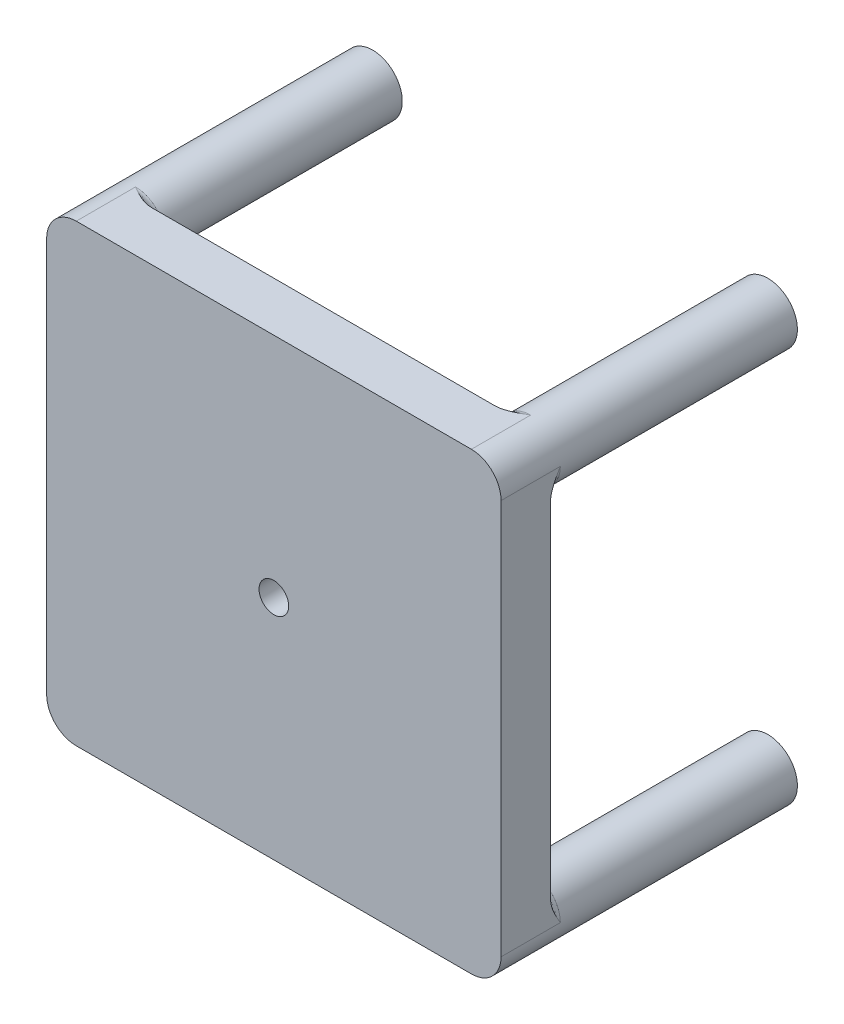
ISO-10303-21;
HEADER;
FILE_DESCRIPTION(('STEP AP214'),'2;1');
FILE_NAME('part.step','',(''),(''),'','','');
FILE_SCHEMA(('AUTOMOTIVE_DESIGN { 1 0 10303 214 1 1 1 1 }'));
ENDSEC;
DATA;
#1=APPLICATION_CONTEXT('core data for automotive mechanical design processes');
#2=APPLICATION_PROTOCOL_DEFINITION('international standard','automotive_design',2000,#1);
#3=PRODUCT_CONTEXT('',#1,'mechanical');
#4=PRODUCT('Part','Part','',(#3));
#5=PRODUCT_RELATED_PRODUCT_CATEGORY('part','',(#4));
#6=PRODUCT_DEFINITION_FORMATION('','',#4);
#7=PRODUCT_DEFINITION_CONTEXT('part definition',#1,'design');
#8=PRODUCT_DEFINITION('design','',#6,#7);
#9=PRODUCT_DEFINITION_SHAPE('','',#8);
#10=(LENGTH_UNIT() NAMED_UNIT(*) SI_UNIT(.MILLI.,.METRE.));
#11=(NAMED_UNIT(*) PLANE_ANGLE_UNIT() SI_UNIT($,.RADIAN.));
#12=(NAMED_UNIT(*) SI_UNIT($,.STERADIAN.) SOLID_ANGLE_UNIT());
#13=UNCERTAINTY_MEASURE_WITH_UNIT(LENGTH_MEASURE(1.E-05),#10,'distance_accuracy_value','');
#14=(GEOMETRIC_REPRESENTATION_CONTEXT(3) GLOBAL_UNCERTAINTY_ASSIGNED_CONTEXT((#13)) GLOBAL_UNIT_ASSIGNED_CONTEXT((#10,
#11,#12)) REPRESENTATION_CONTEXT('',''));
#15=CARTESIAN_POINT('',(0.,0.,0.));
#16=DIRECTION('',(0.,0.,1.));
#17=DIRECTION('',(1.,0.,0.));
#18=AXIS2_PLACEMENT_3D('',#15,#16,#17);
#19=CARTESIAN_POINT('',(2.7567149821564E-07,39.9999999776482,25.));
#20=DIRECTION('',(0.,0.,-1.));
#21=DIRECTION('',(-1.,0.,0.));
#22=AXIS2_PLACEMENT_3D('',#19,#20,#21);
#23=CYLINDRICAL_SURFACE('',#22,3.00000034272673);
#24=CARTESIAN_POINT('',(2.7567149821564E-07,39.9999999776482,19.));
#25=DIRECTION('',(0.,0.,-1.));
#26=DIRECTION('',(-1.,0.,0.));
#27=AXIS2_PLACEMENT_3D('',#24,#25,#26);
#28=CIRCLE('',#27,3.00000034272673);
#29=CARTESIAN_POINT('',(2.75671498583035E-07,43.000000320375,19.));
#30=VERTEX_POINT('',#29);
#31=CARTESIAN_POINT('',(-3.00000006705523,39.9999999776482,19.));
#32=VERTEX_POINT('',#31);
#33=EDGE_CURVE('E241',#30,#32,#28,.T.);
#34=ORIENTED_EDGE('',*,*,#33,.T.);
#35=DIRECTION('',(0.,0.,-1.));
#36=VECTOR('',#35,1.);
#37=CARTESIAN_POINT('',(-3.00000006705523,39.9999999776482,25.));
#38=LINE('',#37,#36);
#39=CARTESIAN_POINT('',(-3.00000006705523,39.9999999776482,25.));
#40=VERTEX_POINT('',#39);
#41=EDGE_CURVE('E156',#40,#32,#38,.T.);
#42=ORIENTED_EDGE('',*,*,#41,.F.);
#43=CARTESIAN_POINT('',(2.7567149821564E-07,39.9999999776482,25.));
#44=DIRECTION('',(0.,0.,-1.));
#45=DIRECTION('',(-1.,0.,0.));
#46=AXIS2_PLACEMENT_3D('',#43,#44,#45);
#47=CIRCLE('',#46,3.00000034272673);
#48=CARTESIAN_POINT('',(2.75671498583035E-07,43.000000320375,25.));
#49=VERTEX_POINT('',#48);
#50=EDGE_CURVE('E150',#40,#49,#47,.T.);
#51=ORIENTED_EDGE('',*,*,#50,.T.);
#52=DIRECTION('',(0.,0.,-1.));
#53=VECTOR('',#52,1.);
#54=CARTESIAN_POINT('',(2.75671498583035E-07,43.000000320375,25.));
#55=LINE('',#54,#53);
#56=EDGE_CURVE('E135',#49,#30,#55,.T.);
#57=ORIENTED_EDGE('',*,*,#56,.T.);
#58=EDGE_LOOP('',(#34,#42,#51,#57));
#59=FACE_BOUND('',#58,.T.);
#60=CARTESIAN_POINT('',(2.7567149821564E-07,39.9999999776482,-5.));
#61=DIRECTION('',(0.,0.,-1.));
#62=DIRECTION('',(-1.,0.,0.));
#63=AXIS2_PLACEMENT_3D('',#60,#61,#62);
#64=CIRCLE('',#63,3.);
#65=CARTESIAN_POINT('',(-2.9999997243285,39.9999999776482,-5.));
#66=VERTEX_POINT('',#65);
#67=EDGE_CURVE('E387',#66,#66,#64,.T.);
#68=ORIENTED_EDGE('',*,*,#67,.F.);
#69=EDGE_LOOP('',(#68));
#70=FACE_BOUND('',#69,.T.);
#71=ADVANCED_FACE('F39',(#59,#70),#23,.T.);
#72=CARTESIAN_POINT('',(-3.00000006705523,2.23517419850605E-08,25.));
#73=DIRECTION('',(-1.,0.,0.));
#74=DIRECTION('',(0.,0.,1.));
#75=AXIS2_PLACEMENT_3D('',#72,#73,#74);
#76=PLANE('',#75);
#77=DIRECTION('',(0.,1.,0.));
#78=VECTOR('',#77,1.);
#79=CARTESIAN_POINT('',(-3.00000006705523,2.23517419850605E-08,20.));
#80=LINE('',#79,#78);
#81=CARTESIAN_POINT('',(-3.00000006705523,2.64575135031266,20.));
#82=VERTEX_POINT('',#81);
#83=CARTESIAN_POINT('',(-3.00000006705523,37.3542485370451,20.));
#84=VERTEX_POINT('',#83);
#85=EDGE_CURVE('E160',#82,#84,#80,.T.);
#86=ORIENTED_EDGE('',*,*,#85,.F.);
#87=CARTESIAN_POINT('',(-3.00000006705523,2.64575135031266,20.));
#88=CARTESIAN_POINT('',(-3.00000006705523,2.57016198336439,19.9999805694454));
#89=CARTESIAN_POINT('',(-3.00000006705523,2.49467527798329,19.9962547406682));
#90=CARTESIAN_POINT('',(-3.00000006705523,2.34444812320498,19.9823512795283));
#91=CARTESIAN_POINT('',(-3.00000006705523,2.26970642330828,19.9721874590272));
#92=CARTESIAN_POINT('',(-3.00000006705523,2.04907999549026,19.933822682465));
#93=CARTESIAN_POINT('',(-3.00000006705523,1.90458090500975,19.8976904420534));
#94=CARTESIAN_POINT('',(-3.00000006705523,1.6077420643123,19.8060282246102));
#95=CARTESIAN_POINT('',(-3.00000006705523,1.45587700870992,19.7490381296509));
#96=CARTESIAN_POINT('',(-3.00000006705523,1.15738945346902,19.6225399327557));
#97=CARTESIAN_POINT('',(-3.00000006705523,1.01077319285479,19.5530174900065));
#98=CARTESIAN_POINT('',(-3.00000006705523,0.575079625561138,19.3319536204799));
#99=CARTESIAN_POINT('',(-3.00000006705523,0.292147653571668,19.1686707604753));
#100=CARTESIAN_POINT('',(-3.00000006705523,0.00632455537559661,19.0036514515353));
#101=CARTESIAN_POINT('',(-3.00000006705523,0.00316227741475037,19.0018257092023));
#102=CARTESIAN_POINT('',(-3.00000006705523,2.23517419850605E-08,19.));
#103=B_SPLINE_CURVE_WITH_KNOTS('',3,(#87,#88,#89,#90,#91,#92,#93,#94,#95,#96,#97,#98,#99,#100,
#101,#102),.UNSPECIFIED.,.F.,.F.,(4,2,2,2,2,2,2,4),(0.,0.226523099325113,0.452561861634844,
0.898071978622388,1.38391998838047,1.87032752642806,2.84948261711076,2.86043706834255),.UNSPECIFIED.);
#104=CARTESIAN_POINT('',(-3.00000006705523,2.23517419850605E-08,19.));
#105=VERTEX_POINT('',#104);
#106=EDGE_CURVE('E256',#82,#105,#103,.T.);
#107=ORIENTED_EDGE('',*,*,#106,.T.);
#108=DIRECTION('',(0.,0.,-1.));
#109=VECTOR('',#108,1.);
#110=CARTESIAN_POINT('',(-3.00000006705523,2.23517419850605E-08,25.));
#111=LINE('',#110,#109);
#112=CARTESIAN_POINT('',(-3.00000006705523,2.23517419850605E-08,25.));
#113=VERTEX_POINT('',#112);
#114=EDGE_CURVE('E208',#113,#105,#111,.T.);
#115=ORIENTED_EDGE('',*,*,#114,.F.);
#116=DIRECTION('',(0.,1.,0.));
#117=VECTOR('',#116,1.);
#118=CARTESIAN_POINT('',(-3.00000006705523,2.23517419850605E-08,25.));
#119=LINE('',#118,#117);
#120=EDGE_CURVE('E141',#113,#40,#119,.T.);
#121=ORIENTED_EDGE('',*,*,#120,.T.);
#122=ORIENTED_EDGE('',*,*,#41,.T.);
#123=CARTESIAN_POINT('',(-3.00000006705523,37.3542485370451,20.));
#124=CARTESIAN_POINT('',(-3.00000006705523,37.4298379087591,19.9999805694405));
#125=CARTESIAN_POINT('',(-3.00000006705523,37.5053246188965,19.9962547404358));
#126=CARTESIAN_POINT('',(-3.00000006705523,37.6555517831477,19.9823512784979));
#127=CARTESIAN_POINT('',(-3.00000006705523,37.730293487761,19.9721874574273));
#128=CARTESIAN_POINT('',(-3.00000006705523,37.950919929677,19.9338226787902));
#129=CARTESIAN_POINT('',(-3.00000006705523,38.0954190294846,19.8976904365043));
#130=CARTESIAN_POINT('',(-3.00000006705523,38.3922578834329,19.806028216521));
#131=CARTESIAN_POINT('',(-3.00000006705523,38.5441229431875,19.7490381215777));
#132=CARTESIAN_POINT('',(-3.00000006705523,38.8426105071439,19.622539925285));
#133=CARTESIAN_POINT('',(-3.00000006705523,38.9892267723233,19.5530174831257));
#134=CARTESIAN_POINT('',(-3.00000006705522,39.424920353695,19.3319536159639));
#135=CARTESIAN_POINT('',(-3.00000006705518,39.7078523357372,19.168670758248));
#136=CARTESIAN_POINT('',(-3.00000006705523,39.9936754442315,19.0036514515802));
#137=CARTESIAN_POINT('',(-3.00000006705523,39.9968377223888,19.0018257092248));
#138=CARTESIAN_POINT('',(-3.00000006705523,39.9999999776482,19.));
#139=B_SPLINE_CURVE_WITH_KNOTS('',3,(#123,#124,#125,#126,#127,#128,#129,#130,#131,#132,#133,
#134,#135,#136,#137,#138),.UNSPECIFIED.,.F.,.F.,(4,2,2,2,2,2,2,4),(0.,0.226523113603853,
0.452561890154132,0.898072035627803,1.3839200571458,1.8703276068537,2.84948272034063,
2.86043717211653),.UNSPECIFIED.);
#140=EDGE_CURVE('E281',#32,#84,#139,.F.);
#141=ORIENTED_EDGE('',*,*,#140,.T.);
#142=EDGE_LOOP('',(#86,#107,#115,#121,#122,#141));
#143=FACE_BOUND('',#142,.T.);
#144=ADVANCED_FACE('F342',(#143),#76,.T.);
#145=CARTESIAN_POINT('',(-2.23517467555501E-08,2.23517419850605E-08,25.));
#146=DIRECTION('',(0.,0.,-1.));
#147=DIRECTION('',(-1.,0.,0.));
#148=AXIS2_PLACEMENT_3D('',#145,#146,#147);
#149=CYLINDRICAL_SURFACE('',#148,3.00000004470348);
#150=CARTESIAN_POINT('',(-2.23517467555501E-08,2.23517419850605E-08,19.));
#151=DIRECTION('',(0.,0.,-1.));
#152=DIRECTION('',(-1.,0.,0.));
#153=AXIS2_PLACEMENT_3D('',#150,#151,#152);
#154=CIRCLE('',#153,3.00000004470348);
#155=CARTESIAN_POINT('',(-2.23517467555501E-08,-3.00000002235174,19.));
#156=VERTEX_POINT('',#155);
#157=EDGE_CURVE('E220',#105,#156,#154,.T.);
#158=ORIENTED_EDGE('',*,*,#157,.T.);
#159=DIRECTION('',(0.,0.,-1.));
#160=VECTOR('',#159,1.);
#161=CARTESIAN_POINT('',(-2.23517467555501E-08,-3.00000002235174,25.));
#162=LINE('',#161,#160);
#163=CARTESIAN_POINT('',(-2.23517467555501E-08,-3.00000002235174,25.));
#164=VERTEX_POINT('',#163);
#165=EDGE_CURVE('E187',#164,#156,#162,.T.);
#166=ORIENTED_EDGE('',*,*,#165,.F.);
#167=CARTESIAN_POINT('',(-2.23517467555501E-08,2.23517419850605E-08,25.));
#168=DIRECTION('',(0.,0.,-1.));
#169=DIRECTION('',(-1.,0.,0.));
#170=AXIS2_PLACEMENT_3D('',#167,#168,#169);
#171=CIRCLE('',#170,3.00000004470348);
#172=EDGE_CURVE('E176',#164,#113,#171,.T.);
#173=ORIENTED_EDGE('',*,*,#172,.T.);
#174=ORIENTED_EDGE('',*,*,#114,.T.);
#175=EDGE_LOOP('',(#158,#166,#173,#174));
#176=FACE_BOUND('',#175,.T.);
#177=CARTESIAN_POINT('',(0.,0.,-5.));
#178=DIRECTION('',(0.,0.,-1.));
#179=DIRECTION('',(-1.,0.,0.));
#180=AXIS2_PLACEMENT_3D('',#177,#178,#179);
#181=CIRCLE('',#180,3.);
#182=CARTESIAN_POINT('',(-3.,0.,-5.));
#183=VERTEX_POINT('',#182);
#184=EDGE_CURVE('E382',#183,#183,#181,.T.);
#185=ORIENTED_EDGE('',*,*,#184,.F.);
#186=EDGE_LOOP('',(#185));
#187=FACE_BOUND('',#186,.T.);
#188=ADVANCED_FACE('F333',(#176,#187),#149,.T.);
#189=CARTESIAN_POINT('',(39.9999999776483,-3.00000002235174,25.));
#190=DIRECTION('',(0.,-1.,0.));
#191=DIRECTION('',(0.,0.,-1.));
#192=AXIS2_PLACEMENT_3D('',#189,#190,#191);
#193=PLANE('',#192);
#194=DIRECTION('',(-1.,0.,0.));
#195=VECTOR('',#194,1.);
#196=CARTESIAN_POINT('',(39.9999999776483,-3.00000002235174,20.));
#197=LINE('',#196,#195);
#198=CARTESIAN_POINT('',(37.3542486581355,-3.00000002235174,20.));
#199=VERTEX_POINT('',#198);
#200=CARTESIAN_POINT('',(2.64575130560917,-3.00000002235174,20.));
#201=VERTEX_POINT('',#200);
#202=EDGE_CURVE('E159',#199,#201,#197,.T.);
#203=ORIENTED_EDGE('',*,*,#202,.F.);
#204=CARTESIAN_POINT('',(37.3542486581355,-3.00000002235174,20.));
#205=CARTESIAN_POINT('',(37.4298380247265,-3.00000002235174,19.9999805694458));
#206=CARTESIAN_POINT('',(37.505324729751,-3.00000002235174,19.9962547406856));
#207=CARTESIAN_POINT('',(37.6555518838191,-3.00000002235174,19.9823512796055));
#208=CARTESIAN_POINT('',(37.7302935833622,-3.00000002235174,19.9721874591471));
#209=CARTESIAN_POINT('',(37.9509200101227,-3.00000002235174,19.9338226827405));
#210=CARTESIAN_POINT('',(38.0954190999034,-3.00000002235174,19.8976904424696));
#211=CARTESIAN_POINT('',(38.3922579396067,-3.00000002235174,19.8060282252169));
#212=CARTESIAN_POINT('',(38.5441229948976,-3.00000002235174,19.7490381302562));
#213=CARTESIAN_POINT('',(38.8426105494849,-3.00000002235174,19.6225399333163));
#214=CARTESIAN_POINT('',(38.9892268097569,-3.00000002235174,19.5530174905233));
#215=CARTESIAN_POINT('',(39.4249203759936,-3.00000002235173,19.3319536208174));
#216=CARTESIAN_POINT('',(39.7078523472258,-3.00000002235171,19.1686707606352));
#217=CARTESIAN_POINT('',(39.9936754446537,-3.00000002235174,19.0036514515317));
#218=CARTESIAN_POINT('',(39.9968377225999,-3.00000002235174,19.0018257092005));
#219=CARTESIAN_POINT('',(39.9999999776483,-3.00000002235174,19.));
#220=B_SPLINE_CURVE_WITH_KNOTS('',3,(#204,#205,#206,#207,#208,#209,#210,#211,#212,#213,#214,
#215,#216,#217,#218,#219),.UNSPECIFIED.,.F.,.F.,(4,2,2,2,2,2,2,4),(0.,0.226523098254635,
0.452561859496658,0.898071974346983,1.38391998322294,1.87032752039565,2.84948260936848,
2.86043706055951),.UNSPECIFIED.);
#221=CARTESIAN_POINT('',(39.9999999776483,-3.00000002235174,19.));
#222=VERTEX_POINT('',#221);
#223=EDGE_CURVE('E307',#199,#222,#220,.T.);
#224=ORIENTED_EDGE('',*,*,#223,.T.);
#225=DIRECTION('',(0.,0.,-1.));
#226=VECTOR('',#225,1.);
#227=CARTESIAN_POINT('',(39.9999999776483,-3.00000002235174,25.));
#228=LINE('',#227,#226);
#229=CARTESIAN_POINT('',(39.9999999776483,-3.00000002235174,25.));
#230=VERTEX_POINT('',#229);
#231=EDGE_CURVE('E183',#230,#222,#228,.T.);
#232=ORIENTED_EDGE('',*,*,#231,.F.);
#233=DIRECTION('',(-1.,0.,0.));
#234=VECTOR('',#233,1.);
#235=CARTESIAN_POINT('',(39.9999999776483,-3.00000002235174,25.));
#236=LINE('',#235,#234);
#237=EDGE_CURVE('E173',#230,#164,#236,.T.);
#238=ORIENTED_EDGE('',*,*,#237,.T.);
#239=ORIENTED_EDGE('',*,*,#165,.T.);
#240=CARTESIAN_POINT('',(2.64575130560917,-3.00000002235174,20.));
#241=CARTESIAN_POINT('',(2.5701619386609,-3.00000002235174,19.9999805694454));
#242=CARTESIAN_POINT('',(2.4946752332798,-3.00000002235174,19.9962547406682));
#243=CARTESIAN_POINT('',(2.3444480785015,-3.00000002235174,19.9823512795283));
#244=CARTESIAN_POINT('',(2.26970637860479,-3.00000002235174,19.9721874590272));
#245=CARTESIAN_POINT('',(2.04907995078677,-3.00000002235174,19.933822682465));
#246=CARTESIAN_POINT('',(1.90458086030626,-3.00000002235174,19.8976904420534));
#247=CARTESIAN_POINT('',(1.60774201960881,-3.00000002235174,19.8060282246102));
#248=CARTESIAN_POINT('',(1.45587696400644,-3.00000002235174,19.7490381296509));
#249=CARTESIAN_POINT('',(1.15738940876553,-3.00000002235174,19.6225399327557));
#250=CARTESIAN_POINT('',(1.0107731481513,-3.00000002235174,19.5530174900064));
#251=CARTESIAN_POINT('',(0.575079580857648,-3.00000002235174,19.3319536204799));
#252=CARTESIAN_POINT('',(0.292147608868174,-3.00000002235174,19.1686707604753));
#253=CARTESIAN_POINT('',(0.00632451067210741,-3.00000002235174,19.0036514515353));
#254=CARTESIAN_POINT('',(0.0031622327112614,-3.00000002235174,19.0018257092023));
#255=CARTESIAN_POINT('',(-2.23517467555501E-08,-3.00000002235174,19.));
#256=B_SPLINE_CURVE_WITH_KNOTS('',3,(#240,#241,#242,#243,#244,#245,#246,#247,#248,#249,#250,
#251,#252,#253,#254,#255),.UNSPECIFIED.,.F.,.F.,(4,2,2,2,2,2,2,4),(0.,0.226523099325112,
0.452561861634844,0.898071978622388,1.38391998838047,1.87032752642806,2.84948261711076,
2.86043706834255),.UNSPECIFIED.);
#257=EDGE_CURVE('E247',#156,#201,#256,.F.);
#258=ORIENTED_EDGE('',*,*,#257,.T.);
#259=EDGE_LOOP('',(#203,#224,#232,#238,#239,#258));
#260=FACE_BOUND('',#259,.T.);
#261=ADVANCED_FACE('F261',(#260),#193,.T.);
#262=CARTESIAN_POINT('',(39.9999999776483,0.,25.));
#263=DIRECTION('',(0.,0.,-1.));
#264=DIRECTION('',(-1.,0.,0.));
#265=AXIS2_PLACEMENT_3D('',#262,#263,#264);
#266=CYLINDRICAL_SURFACE('',#265,3.00000002235174);
#267=CARTESIAN_POINT('',(39.9999999776483,0.,19.));
#268=DIRECTION('',(0.,0.,-1.));
#269=DIRECTION('',(-1.,0.,0.));
#270=AXIS2_PLACEMENT_3D('',#267,#268,#269);
#271=CIRCLE('',#270,3.00000002235174);
#272=CARTESIAN_POINT('',(43.,0.,19.));
#273=VERTEX_POINT('',#272);
#274=EDGE_CURVE('E243',#222,#273,#271,.T.);
#275=ORIENTED_EDGE('',*,*,#274,.T.);
#276=DIRECTION('',(0.,0.,-1.));
#277=VECTOR('',#276,1.);
#278=CARTESIAN_POINT('',(43.,0.,25.));
#279=LINE('',#278,#277);
#280=CARTESIAN_POINT('',(43.,0.,25.));
#281=VERTEX_POINT('',#280);
#282=EDGE_CURVE('E190',#281,#273,#279,.T.);
#283=ORIENTED_EDGE('',*,*,#282,.F.);
#284=CARTESIAN_POINT('',(39.9999999776483,0.,25.));
#285=DIRECTION('',(0.,0.,-1.));
#286=DIRECTION('',(-1.,0.,0.));
#287=AXIS2_PLACEMENT_3D('',#284,#285,#286);
#288=CIRCLE('',#287,3.00000002235174);
#289=EDGE_CURVE('E167',#281,#230,#288,.T.);
#290=ORIENTED_EDGE('',*,*,#289,.T.);
#291=ORIENTED_EDGE('',*,*,#231,.T.);
#292=EDGE_LOOP('',(#275,#283,#290,#291));
#293=FACE_BOUND('',#292,.T.);
#294=CARTESIAN_POINT('',(40.,0.,-5.));
#295=DIRECTION('',(0.,0.,-1.));
#296=DIRECTION('',(-1.,0.,0.));
#297=AXIS2_PLACEMENT_3D('',#294,#295,#296);
#298=CIRCLE('',#297,3.);
#299=CARTESIAN_POINT('',(37.,0.,-5.));
#300=VERTEX_POINT('',#299);
#301=EDGE_CURVE('E378',#300,#300,#298,.T.);
#302=ORIENTED_EDGE('',*,*,#301,.F.);
#303=EDGE_LOOP('',(#302));
#304=FACE_BOUND('',#303,.T.);
#305=ADVANCED_FACE('F326',(#293,#304),#266,.T.);
#306=CARTESIAN_POINT('',(43.,40.,25.));
#307=DIRECTION('',(1.,0.,0.));
#308=DIRECTION('',(0.,0.,-1.));
#309=AXIS2_PLACEMENT_3D('',#306,#307,#308);
#310=PLANE('',#309);
#311=DIRECTION('',(0.,-1.,0.));
#312=VECTOR('',#311,1.);
#313=CARTESIAN_POINT('',(43.,40.,20.));
#314=LINE('',#313,#312);
#315=CARTESIAN_POINT('',(43.,37.3542485678451,20.));
#316=VERTEX_POINT('',#315);
#317=CARTESIAN_POINT('',(43.,2.64575131951275,20.));
#318=VERTEX_POINT('',#317);
#319=EDGE_CURVE('E198',#316,#318,#314,.T.);
#320=ORIENTED_EDGE('',*,*,#319,.F.);
#321=CARTESIAN_POINT('',(43.,37.3542485678451,20.));
#322=CARTESIAN_POINT('',(43.,37.4298379392011,19.9999805694408));
#323=CARTESIAN_POINT('',(43.,37.5053246489812,19.9962547404532));
#324=CARTESIAN_POINT('',(43.,37.6555518125208,19.9823512785755));
#325=CARTESIAN_POINT('',(43.,37.73029351678,19.9721874575477));
#326=CARTESIAN_POINT('',(43.,37.9509199576392,19.9338226790662));
#327=CARTESIAN_POINT('',(43.,38.0954190567482,19.8976904369206));
#328=CARTESIAN_POINT('',(43.,38.3922579097041,19.8060282171278));
#329=CARTESIAN_POINT('',(43.,38.5441229691477,19.7490381221838));
#330=CARTESIAN_POINT('',(43.,38.8426105324502,19.6225399258442));
#331=CARTESIAN_POINT('',(43.,38.9892267972865,19.5530174836385));
#332=CARTESIAN_POINT('',(43.,39.4249203776068,19.3319536163074));
#333=CARTESIAN_POINT('',(43.,39.7078523589085,19.1686707584445));
#334=CARTESIAN_POINT('',(43.,39.9936754666131,19.0036514515775));
#335=CARTESIAN_POINT('',(43.,39.9968377447555,19.0018257092234));
#336=CARTESIAN_POINT('',(43.,40.,19.));
#337=B_SPLINE_CURVE_WITH_KNOTS('',3,(#321,#322,#323,#324,#325,#326,#327,#328,#329,#330,#331,
#332,#333,#334,#335,#336),.UNSPECIFIED.,.F.,.F.,(4,2,2,2,2,2,2,4),(0.,0.226523112531202,
0.452561888012097,0.898072031352399,1.38392005198888,1.87032760082368,2.84948271259839,
2.86043716433348),.UNSPECIFIED.);
#338=CARTESIAN_POINT('',(43.,40.,19.));
#339=VERTEX_POINT('',#338);
#340=EDGE_CURVE('E11',#316,#339,#337,.T.);
#341=ORIENTED_EDGE('',*,*,#340,.T.);
#342=DIRECTION('',(0.,0.,-1.));
#343=VECTOR('',#342,1.);
#344=CARTESIAN_POINT('',(43.,40.,25.));
#345=LINE('',#344,#343);
#346=CARTESIAN_POINT('',(43.,40.,25.));
#347=VERTEX_POINT('',#346);
#348=EDGE_CURVE('E66',#347,#339,#345,.T.);
#349=ORIENTED_EDGE('',*,*,#348,.F.);
#350=DIRECTION('',(0.,-1.,0.));
#351=VECTOR('',#350,1.);
#352=CARTESIAN_POINT('',(43.,40.,25.));
#353=LINE('',#352,#351);
#354=EDGE_CURVE('E170',#347,#281,#353,.T.);
#355=ORIENTED_EDGE('',*,*,#354,.T.);
#356=ORIENTED_EDGE('',*,*,#282,.T.);
#357=CARTESIAN_POINT('',(43.,2.64575131951275,20.));
#358=CARTESIAN_POINT('',(43.,2.57016195292206,19.9999805694458));
#359=CARTESIAN_POINT('',(43.,2.49467524789783,19.9962547406857));
#360=CARTESIAN_POINT('',(43.,2.34444809383025,19.9823512796056));
#361=CARTESIAN_POINT('',(43.,2.2697063942874,19.9721874591473));
#362=CARTESIAN_POINT('',(43.,2.04907996752658,19.9338226827407));
#363=CARTESIAN_POINT('',(43.,1.90458087774536,19.8976904424696));
#364=CARTESIAN_POINT('',(43.,1.60774203804139,19.8060282252169));
#365=CARTESIAN_POINT('',(43.,1.45587698275031,19.7490381302565));
#366=CARTESIAN_POINT('',(43.,1.15738942816314,19.6225399333157));
#367=CARTESIAN_POINT('',(43.,1.01077316789149,19.5530174905217));
#368=CARTESIAN_POINT('',(43.,0.575079601652537,19.3319536208198));
#369=CARTESIAN_POINT('',(43.,0.292147630413557,19.1686707606499));
#370=CARTESIAN_POINT('',(43.,0.00632453299431452,19.0036514515321));
#371=CARTESIAN_POINT('',(43.,0.00316225504823767,19.0018257092007));
#372=CARTESIAN_POINT('',(43.,0.,19.));
#373=B_SPLINE_CURVE_WITH_KNOTS('',3,(#357,#358,#359,#360,#361,#362,#363,#364,#365,#366,#367,
#368,#369,#370,#371,#372),.UNSPECIFIED.,.F.,.F.,(4,2,2,2,2,2,2,4),(0.,0.226523098253761,
0.452561859495101,0.898071974346984,1.38391998322318,1.87032752039661,2.84948260936848,
2.86043706055951),.UNSPECIFIED.);
#374=EDGE_CURVE('E295',#273,#318,#373,.F.);
#375=ORIENTED_EDGE('',*,*,#374,.T.);
#376=EDGE_LOOP('',(#320,#341,#349,#355,#356,#375));
#377=FACE_BOUND('',#376,.T.);
#378=ADVANCED_FACE('F321',(#377),#310,.T.);
#379=CARTESIAN_POINT('',(39.999999679625,40.,25.));
#380=DIRECTION('',(0.,0.,-1.));
#381=DIRECTION('',(-1.,0.,0.));
#382=AXIS2_PLACEMENT_3D('',#379,#380,#381);
#383=CYLINDRICAL_SURFACE('',#382,3.00000032037495);
#384=CARTESIAN_POINT('',(39.999999679625,40.,19.));
#385=DIRECTION('',(0.,0.,-1.));
#386=DIRECTION('',(-1.,0.,0.));
#387=AXIS2_PLACEMENT_3D('',#384,#385,#386);
#388=CIRCLE('',#387,3.00000032037495);
#389=CARTESIAN_POINT('',(39.999999679625,43.0000003203749,19.));
#390=VERTEX_POINT('',#389);
#391=EDGE_CURVE('E246',#339,#390,#388,.T.);
#392=ORIENTED_EDGE('',*,*,#391,.T.);
#393=DIRECTION('',(0.,0.,-1.));
#394=VECTOR('',#393,1.);
#395=CARTESIAN_POINT('',(39.999999679625,43.0000003203749,25.));
#396=LINE('',#395,#394);
#397=CARTESIAN_POINT('',(39.999999679625,43.0000003203749,25.));
#398=VERTEX_POINT('',#397);
#399=EDGE_CURVE('E58',#398,#390,#396,.T.);
#400=ORIENTED_EDGE('',*,*,#399,.F.);
#401=CARTESIAN_POINT('',(39.999999679625,40.,25.));
#402=DIRECTION('',(0.,0.,-1.));
#403=DIRECTION('',(-1.,0.,0.));
#404=AXIS2_PLACEMENT_3D('',#401,#402,#403);
#405=CIRCLE('',#404,3.00000032037495);
#406=EDGE_CURVE('E151',#398,#347,#405,.T.);
#407=ORIENTED_EDGE('',*,*,#406,.T.);
#408=ORIENTED_EDGE('',*,*,#348,.T.);
#409=EDGE_LOOP('',(#392,#400,#407,#408));
#410=FACE_BOUND('',#409,.T.);
#411=CARTESIAN_POINT('',(40.,40.,-5.));
#412=DIRECTION('',(0.,0.,-1.));
#413=DIRECTION('',(-1.,0.,0.));
#414=AXIS2_PLACEMENT_3D('',#411,#412,#413);
#415=CIRCLE('',#414,2.99999999999999);
#416=CARTESIAN_POINT('',(37.,40.,-5.));
#417=VERTEX_POINT('',#416);
#418=EDGE_CURVE('E381',#417,#417,#415,.T.);
#419=ORIENTED_EDGE('',*,*,#418,.F.);
#420=EDGE_LOOP('',(#419));
#421=FACE_BOUND('',#420,.T.);
#422=ADVANCED_FACE('F303',(#410,#421),#383,.T.);
#423=CARTESIAN_POINT('',(2.75671498583035E-07,43.000000320375,25.));
#424=DIRECTION('',(0.,1.,0.));
#425=DIRECTION('',(-1.,0.,0.));
#426=AXIS2_PLACEMENT_3D('',#423,#424,#425);
#427=PLANE('',#426);
#428=DIRECTION('',(1.,0.,0.));
#429=VECTOR('',#428,1.);
#430=CARTESIAN_POINT('',(2.75671498583035E-07,43.000000320375,20.));
#431=LINE('',#430,#429);
#432=CARTESIAN_POINT('',(2.64575171627461,43.000000320375,20.));
#433=VERTEX_POINT('',#432);
#434=CARTESIAN_POINT('',(37.3542482474701,43.0000003203749,20.));
#435=VERTEX_POINT('',#434);
#436=EDGE_CURVE('E201',#433,#435,#431,.T.);
#437=ORIENTED_EDGE('',*,*,#436,.F.);
#438=CARTESIAN_POINT('',(2.64575171627461,43.000000320375,20.));
#439=CARTESIAN_POINT('',(2.57016234456124,43.000000320375,19.9999805694405));
#440=CARTESIAN_POINT('',(2.49467563442444,43.000000320375,19.9962547404358));
#441=CARTESIAN_POINT('',(2.34444847017439,43.000000320375,19.9823512784982));
#442=CARTESIAN_POINT('',(2.26970676556157,43.000000320375,19.9721874574278));
#443=CARTESIAN_POINT('',(2.04908032364493,43.000000320375,19.9338226787907));
#444=CARTESIAN_POINT('',(1.90458122383629,43.000000320375,19.8976904365044));
#445=CARTESIAN_POINT('',(1.60774236988653,43.000000320375,19.8060282165211));
#446=CARTESIAN_POINT('',(1.45587731013146,43.000000320375,19.7490381215783));
#447=CARTESIAN_POINT('',(1.15738974617528,43.000000320375,19.6225399252838));
#448=CARTESIAN_POINT('',(1.0107734809967,43.000000320375,19.5530174831222));
#449=CARTESIAN_POINT('',(0.575079899620198,43.000000320375,19.3319536159691));
#450=CARTESIAN_POINT('',(0.292147917563524,43.000000320375,19.1686707582796));
#451=CARTESIAN_POINT('',(0.00632480908784104,43.000000320375,19.003651451581));
#452=CARTESIAN_POINT('',(0.00316253093075128,43.000000320375,19.0018257092251));
#453=CARTESIAN_POINT('',(2.75671499256475E-07,43.000000320375,19.));
#454=B_SPLINE_CURVE_WITH_KNOTS('',3,(#438,#439,#440,#441,#442,#443,#444,#445,#446,#447,#448,
#449,#450,#451,#452,#453),.UNSPECIFIED.,.F.,.F.,(4,2,2,2,2,2,2,4),(0.,0.226523113601978,
0.452561890150812,0.898072035627804,1.38392005714631,1.87032760685575,2.84948272034063,
2.86043717211655),.UNSPECIFIED.);
#455=EDGE_CURVE('E138',#433,#30,#454,.T.);
#456=ORIENTED_EDGE('',*,*,#455,.T.);
#457=ORIENTED_EDGE('',*,*,#56,.F.);
#458=DIRECTION('',(1.,0.,0.));
#459=VECTOR('',#458,1.);
#460=CARTESIAN_POINT('',(2.75671498583035E-07,43.000000320375,25.));
#461=LINE('',#460,#459);
#462=EDGE_CURVE('E136',#49,#398,#461,.T.);
#463=ORIENTED_EDGE('',*,*,#462,.T.);
#464=ORIENTED_EDGE('',*,*,#399,.T.);
#465=CARTESIAN_POINT('',(37.3542482474701,43.0000003203749,20.));
#466=CARTESIAN_POINT('',(37.4298376188266,43.0000003203749,19.9999805694409));
#467=CARTESIAN_POINT('',(37.5053243286073,43.0000003203749,19.9962547404532));
#468=CARTESIAN_POINT('',(37.6555514921478,43.0000003203749,19.9823512785753));
#469=CARTESIAN_POINT('',(37.7302931964073,43.0000003203749,19.9721874575474));
#470=CARTESIAN_POINT('',(37.9509196372661,43.0000003203749,19.9338226790658));
#471=CARTESIAN_POINT('',(38.0954187363742,43.0000003203749,19.8976904369205));
#472=CARTESIAN_POINT('',(38.3922575893289,43.0000003203749,19.8060282171277));
#473=CARTESIAN_POINT('',(38.5441226487721,43.0000003203749,19.7490381221832));
#474=CARTESIAN_POINT('',(38.8426102120748,43.0000003203749,19.6225399258452));
#475=CARTESIAN_POINT('',(38.9892264769117,43.0000003203749,19.5530174836415));
#476=CARTESIAN_POINT('',(39.424920057228,43.0000003203749,19.3319536163031));
#477=CARTESIAN_POINT('',(39.7078520385175,43.0000003203749,19.1686707584179));
#478=CARTESIAN_POINT('',(39.9936751462378,43.0000003203749,19.0036514515769));
#479=CARTESIAN_POINT('',(39.9968374243803,43.0000003203749,19.0018257092231));
#480=CARTESIAN_POINT('',(39.999999679625,43.0000003203749,19.));
#481=B_SPLINE_CURVE_WITH_KNOTS('',3,(#465,#466,#467,#468,#469,#470,#471,#472,#473,#474,#475,
#476,#477,#478,#479,#480),.UNSPECIFIED.,.F.,.F.,(4,2,2,2,2,2,2,4),(0.,0.226523112532768,
0.452561888014884,0.898072031352396,1.38392005198843,1.87032760082193,2.84948271259837,
2.86043716433347),.UNSPECIFIED.);
#482=EDGE_CURVE('E52',#390,#435,#481,.F.);
#483=ORIENTED_EDGE('',*,*,#482,.T.);
#484=EDGE_LOOP('',(#437,#456,#457,#463,#464,#483));
#485=FACE_BOUND('',#484,.T.);
#486=ADVANCED_FACE('F132',(#485),#427,.T.);
#487=CARTESIAN_POINT('',(2.7567149821564E-07,39.9999999776482,25.));
#488=DIRECTION('',(0.,0.,-1.));
#489=DIRECTION('',(-1.,0.,0.));
#490=AXIS2_PLACEMENT_3D('',#487,#488,#489);
#491=PLANE('',#490);
#492=CARTESIAN_POINT('',(19.9999999664441,20.,25.));
#493=DIRECTION('',(0.,0.,-1.));
#494=DIRECTION('',(-1.,0.,0.));
#495=AXIS2_PLACEMENT_3D('',#492,#493,#494);
#496=CIRCLE('',#495,1.5);
#497=CARTESIAN_POINT('',(18.4999999664441,20.,25.));
#498=VERTEX_POINT('',#497);
#499=EDGE_CURVE('E182',#498,#498,#496,.T.);
#500=ORIENTED_EDGE('',*,*,#499,.T.);
#501=EDGE_LOOP('',(#500));
#502=FACE_BOUND('',#501,.T.);
#503=ORIENTED_EDGE('',*,*,#50,.F.);
#504=ORIENTED_EDGE('',*,*,#120,.F.);
#505=ORIENTED_EDGE('',*,*,#172,.F.);
#506=ORIENTED_EDGE('',*,*,#237,.F.);
#507=ORIENTED_EDGE('',*,*,#289,.F.);
#508=ORIENTED_EDGE('',*,*,#354,.F.);
#509=ORIENTED_EDGE('',*,*,#406,.F.);
#510=ORIENTED_EDGE('',*,*,#462,.F.);
#511=EDGE_LOOP('',(#503,#504,#505,#506,#507,#508,#509,#510));
#512=FACE_BOUND('',#511,.T.);
#513=ADVANCED_FACE('F149',(#502,#512),#491,.F.);
#514=CARTESIAN_POINT('',(2.7567149821564E-07,39.9999999776482,20.));
#515=DIRECTION('',(0.,0.,-1.));
#516=DIRECTION('',(-1.,0.,0.));
#517=AXIS2_PLACEMENT_3D('',#514,#515,#516);
#518=PLANE('',#517);
#519=ORIENTED_EDGE('',*,*,#202,.T.);
#520=CARTESIAN_POINT('',(-2.23517467555501E-08,2.23517419850605E-08,20.));
#521=DIRECTION('',(0.,0.,-1.));
#522=DIRECTION('',(-1.,0.,0.));
#523=AXIS2_PLACEMENT_3D('',#520,#521,#522);
#524=CIRCLE('',#523,4.00000004470348);
#525=EDGE_CURVE('E237',#201,#82,#524,.F.);
#526=ORIENTED_EDGE('',*,*,#525,.T.);
#527=ORIENTED_EDGE('',*,*,#85,.T.);
#528=CARTESIAN_POINT('',(2.7567149821564E-07,39.9999999776482,20.));
#529=DIRECTION('',(0.,0.,-1.));
#530=DIRECTION('',(-1.,0.,0.));
#531=AXIS2_PLACEMENT_3D('',#528,#529,#530);
#532=CIRCLE('',#531,4.00000034272673);
#533=EDGE_CURVE('E232',#84,#433,#532,.F.);
#534=ORIENTED_EDGE('',*,*,#533,.T.);
#535=ORIENTED_EDGE('',*,*,#436,.T.);
#536=CARTESIAN_POINT('',(39.999999679625,40.,20.));
#537=DIRECTION('',(0.,0.,-1.));
#538=DIRECTION('',(-1.,0.,0.));
#539=AXIS2_PLACEMENT_3D('',#536,#537,#538);
#540=CIRCLE('',#539,4.00000032037495);
#541=EDGE_CURVE('E228',#435,#316,#540,.F.);
#542=ORIENTED_EDGE('',*,*,#541,.T.);
#543=ORIENTED_EDGE('',*,*,#319,.T.);
#544=CARTESIAN_POINT('',(39.9999999776483,0.,20.));
#545=DIRECTION('',(0.,0.,-1.));
#546=DIRECTION('',(-1.,0.,0.));
#547=AXIS2_PLACEMENT_3D('',#544,#545,#546);
#548=CIRCLE('',#547,4.00000002235174);
#549=EDGE_CURVE('E230',#318,#199,#548,.F.);
#550=ORIENTED_EDGE('',*,*,#549,.T.);
#551=EDGE_LOOP('',(#519,#526,#527,#534,#535,#542,#543,#550));
#552=FACE_BOUND('',#551,.T.);
#553=CARTESIAN_POINT('',(19.9999999664441,20.,20.));
#554=DIRECTION('',(0.,0.,1.));
#555=DIRECTION('',(1.,0.,0.));
#556=AXIS2_PLACEMENT_3D('',#553,#554,#555);
#557=CIRCLE('',#556,3.5);
#558=CARTESIAN_POINT('',(23.4999999664441,20.,20.));
#559=VERTEX_POINT('',#558);
#560=EDGE_CURVE('E161',#559,#559,#557,.T.);
#561=ORIENTED_EDGE('',*,*,#560,.T.);
#562=EDGE_LOOP('',(#561));
#563=FACE_BOUND('',#562,.T.);
#564=ADVANCED_FACE('F325',(#552,#563),#518,.T.);
#565=CARTESIAN_POINT('',(19.9999999664441,20.,20.));
#566=DIRECTION('',(0.,0.,-1.));
#567=DIRECTION('',(1.,0.,0.));
#568=AXIS2_PLACEMENT_3D('',#565,#566,#567);
#569=CONICAL_SURFACE('',#568,3.5,0.78539816339745);
#570=CARTESIAN_POINT('',(19.9999999664441,20.,22.));
#571=DIRECTION('',(0.,0.,-1.));
#572=DIRECTION('',(-1.,0.,0.));
#573=AXIS2_PLACEMENT_3D('',#570,#571,#572);
#574=CIRCLE('',#573,1.5);
#575=CARTESIAN_POINT('',(18.4999999664441,20.,22.));
#576=VERTEX_POINT('',#575);
#577=EDGE_CURVE('E179',#576,#576,#574,.T.);
#578=ORIENTED_EDGE('',*,*,#577,.F.);
#579=EDGE_LOOP('',(#578));
#580=FACE_BOUND('',#579,.T.);
#581=ORIENTED_EDGE('',*,*,#560,.F.);
#582=EDGE_LOOP('',(#581));
#583=FACE_BOUND('',#582,.T.);
#584=ADVANCED_FACE('F350',(#580,#583),#569,.F.);
#585=CARTESIAN_POINT('',(19.9999999664441,20.,25.));
#586=DIRECTION('',(0.,0.,-1.));
#587=DIRECTION('',(-1.,0.,0.));
#588=AXIS2_PLACEMENT_3D('',#585,#586,#587);
#589=CYLINDRICAL_SURFACE('',#588,1.5);
#590=ORIENTED_EDGE('',*,*,#577,.T.);
#591=EDGE_LOOP('',(#590));
#592=FACE_BOUND('',#591,.T.);
#593=ORIENTED_EDGE('',*,*,#499,.F.);
#594=EDGE_LOOP('',(#593));
#595=FACE_BOUND('',#594,.T.);
#596=ADVANCED_FACE('F349',(#592,#595),#589,.F.);
#597=CARTESIAN_POINT('',(40.,0.,-5.));
#598=DIRECTION('',(0.,0.,-1.));
#599=DIRECTION('',(-1.,0.,0.));
#600=AXIS2_PLACEMENT_3D('',#597,#598,#599);
#601=PLANE('',#600);
#602=CARTESIAN_POINT('',(39.9999999776483,0.,-5.));
#603=DIRECTION('',(0.,0.,-1.));
#604=DIRECTION('',(-1.,0.,0.));
#605=AXIS2_PLACEMENT_3D('',#602,#603,#604);
#606=CIRCLE('',#605,1.35);
#607=CARTESIAN_POINT('',(38.6499999776483,0.,-5.));
#608=VERTEX_POINT('',#607);
#609=EDGE_CURVE('E396',#608,#608,#606,.T.);
#610=ORIENTED_EDGE('',*,*,#609,.F.);
#611=EDGE_LOOP('',(#610));
#612=FACE_BOUND('',#611,.T.);
#613=ORIENTED_EDGE('',*,*,#301,.T.);
#614=EDGE_LOOP('',(#613));
#615=FACE_BOUND('',#614,.T.);
#616=ADVANCED_FACE('F358',(#612,#615),#601,.T.);
#617=CARTESIAN_POINT('',(0.,0.,-5.));
#618=DIRECTION('',(0.,0.,-1.));
#619=DIRECTION('',(-1.,0.,0.));
#620=AXIS2_PLACEMENT_3D('',#617,#618,#619);
#621=PLANE('',#620);
#622=CARTESIAN_POINT('',(0.,0.,-5.));
#623=DIRECTION('',(0.,0.,-1.));
#624=DIRECTION('',(-1.,0.,0.));
#625=AXIS2_PLACEMENT_3D('',#622,#623,#624);
#626=CIRCLE('',#625,1.35);
#627=CARTESIAN_POINT('',(-1.35,0.,-5.));
#628=VERTEX_POINT('',#627);
#629=EDGE_CURVE('E391',#628,#628,#626,.T.);
#630=ORIENTED_EDGE('',*,*,#629,.F.);
#631=EDGE_LOOP('',(#630));
#632=FACE_BOUND('',#631,.T.);
#633=ORIENTED_EDGE('',*,*,#184,.T.);
#634=EDGE_LOOP('',(#633));
#635=FACE_BOUND('',#634,.T.);
#636=ADVANCED_FACE('F423',(#632,#635),#621,.T.);
#637=CARTESIAN_POINT('',(2.7567149821564E-07,39.9999999776482,-5.));
#638=DIRECTION('',(0.,0.,-1.));
#639=DIRECTION('',(-1.,0.,0.));
#640=AXIS2_PLACEMENT_3D('',#637,#638,#639);
#641=PLANE('',#640);
#642=CARTESIAN_POINT('',(0.,40.,-5.));
#643=DIRECTION('',(0.,0.,-1.));
#644=DIRECTION('',(-1.,0.,0.));
#645=AXIS2_PLACEMENT_3D('',#642,#643,#644);
#646=CIRCLE('',#645,1.35);
#647=CARTESIAN_POINT('',(-1.35,40.,-5.));
#648=VERTEX_POINT('',#647);
#649=EDGE_CURVE('E405',#648,#648,#646,.T.);
#650=ORIENTED_EDGE('',*,*,#649,.F.);
#651=EDGE_LOOP('',(#650));
#652=FACE_BOUND('',#651,.T.);
#653=ORIENTED_EDGE('',*,*,#67,.T.);
#654=EDGE_LOOP('',(#653));
#655=FACE_BOUND('',#654,.T.);
#656=ADVANCED_FACE('F476',(#652,#655),#641,.T.);
#657=CARTESIAN_POINT('',(40.,40.,-5.));
#658=DIRECTION('',(0.,0.,-1.));
#659=DIRECTION('',(-1.,0.,0.));
#660=AXIS2_PLACEMENT_3D('',#657,#658,#659);
#661=PLANE('',#660);
#662=CARTESIAN_POINT('',(39.999999679625,40.,-5.));
#663=DIRECTION('',(0.,0.,-1.));
#664=DIRECTION('',(-1.,0.,0.));
#665=AXIS2_PLACEMENT_3D('',#662,#663,#664);
#666=CIRCLE('',#665,1.35);
#667=CARTESIAN_POINT('',(38.649999679625,40.,-5.));
#668=VERTEX_POINT('',#667);
#669=EDGE_CURVE('E409',#668,#668,#666,.T.);
#670=ORIENTED_EDGE('',*,*,#669,.F.);
#671=EDGE_LOOP('',(#670));
#672=FACE_BOUND('',#671,.T.);
#673=ORIENTED_EDGE('',*,*,#418,.T.);
#674=EDGE_LOOP('',(#673));
#675=FACE_BOUND('',#674,.T.);
#676=ADVANCED_FACE('F486',(#672,#675),#661,.T.);
#677=CARTESIAN_POINT('',(39.999999679625,40.,10.));
#678=DIRECTION('',(0.,0.,-1.));
#679=DIRECTION('',(-1.,0.,0.));
#680=AXIS2_PLACEMENT_3D('',#677,#678,#679);
#681=CYLINDRICAL_SURFACE('',#680,1.35);
#682=CARTESIAN_POINT('',(39.999999679625,40.,10.));
#683=DIRECTION('',(0.,0.,-1.));
#684=DIRECTION('',(-1.,0.,0.));
#685=AXIS2_PLACEMENT_3D('',#682,#683,#684);
#686=CIRCLE('',#685,1.35);
#687=CARTESIAN_POINT('',(38.649999679625,40.,10.));
#688=VERTEX_POINT('',#687);
#689=EDGE_CURVE('E403',#688,#688,#686,.T.);
#690=ORIENTED_EDGE('',*,*,#689,.F.);
#691=EDGE_LOOP('',(#690));
#692=FACE_BOUND('',#691,.T.);
#693=ORIENTED_EDGE('',*,*,#669,.T.);
#694=EDGE_LOOP('',(#693));
#695=FACE_BOUND('',#694,.T.);
#696=ADVANCED_FACE('F498',(#692,#695),#681,.F.);
#697=CARTESIAN_POINT('',(39.999999679625,40.,10.));
#698=DIRECTION('',(0.,0.,-1.));
#699=DIRECTION('',(-1.,0.,0.));
#700=AXIS2_PLACEMENT_3D('',#697,#698,#699);
#701=PLANE('',#700);
#702=ORIENTED_EDGE('',*,*,#689,.T.);
#703=EDGE_LOOP('',(#702));
#704=FACE_BOUND('',#703,.T.);
#705=ADVANCED_FACE('F507',(#704),#701,.T.);
#706=CARTESIAN_POINT('',(0.,40.,10.));
#707=DIRECTION('',(0.,0.,-1.));
#708=DIRECTION('',(-1.,0.,0.));
#709=AXIS2_PLACEMENT_3D('',#706,#707,#708);
#710=CYLINDRICAL_SURFACE('',#709,1.35);
#711=CARTESIAN_POINT('',(0.,40.,10.));
#712=DIRECTION('',(0.,0.,-1.));
#713=DIRECTION('',(-1.,0.,0.));
#714=AXIS2_PLACEMENT_3D('',#711,#712,#713);
#715=CIRCLE('',#714,1.35);
#716=CARTESIAN_POINT('',(-1.35,40.,10.));
#717=VERTEX_POINT('',#716);
#718=EDGE_CURVE('E397',#717,#717,#715,.T.);
#719=ORIENTED_EDGE('',*,*,#718,.F.);
#720=EDGE_LOOP('',(#719));
#721=FACE_BOUND('',#720,.T.);
#722=ORIENTED_EDGE('',*,*,#649,.T.);
#723=EDGE_LOOP('',(#722));
#724=FACE_BOUND('',#723,.T.);
#725=ADVANCED_FACE('F519',(#721,#724),#710,.F.);
#726=CARTESIAN_POINT('',(0.,40.,10.));
#727=DIRECTION('',(0.,0.,-1.));
#728=DIRECTION('',(-1.,0.,0.));
#729=AXIS2_PLACEMENT_3D('',#726,#727,#728);
#730=PLANE('',#729);
#731=ORIENTED_EDGE('',*,*,#718,.T.);
#732=EDGE_LOOP('',(#731));
#733=FACE_BOUND('',#732,.T.);
#734=ADVANCED_FACE('F528',(#733),#730,.T.);
#735=CARTESIAN_POINT('',(0.,0.,10.));
#736=DIRECTION('',(0.,0.,-1.));
#737=DIRECTION('',(-1.,0.,0.));
#738=AXIS2_PLACEMENT_3D('',#735,#736,#737);
#739=CYLINDRICAL_SURFACE('',#738,1.35);
#740=CARTESIAN_POINT('',(0.,0.,10.));
#741=DIRECTION('',(0.,0.,-1.));
#742=DIRECTION('',(-1.,0.,0.));
#743=AXIS2_PLACEMENT_3D('',#740,#741,#742);
#744=CIRCLE('',#743,1.35);
#745=CARTESIAN_POINT('',(-1.35,0.,10.));
#746=VERTEX_POINT('',#745);
#747=EDGE_CURVE('E389',#746,#746,#744,.T.);
#748=ORIENTED_EDGE('',*,*,#747,.F.);
#749=EDGE_LOOP('',(#748));
#750=FACE_BOUND('',#749,.T.);
#751=ORIENTED_EDGE('',*,*,#629,.T.);
#752=EDGE_LOOP('',(#751));
#753=FACE_BOUND('',#752,.T.);
#754=ADVANCED_FACE('F539',(#750,#753),#739,.F.);
#755=CARTESIAN_POINT('',(0.,0.,10.));
#756=DIRECTION('',(0.,0.,-1.));
#757=DIRECTION('',(-1.,0.,0.));
#758=AXIS2_PLACEMENT_3D('',#755,#756,#757);
#759=PLANE('',#758);
#760=ORIENTED_EDGE('',*,*,#747,.T.);
#761=EDGE_LOOP('',(#760));
#762=FACE_BOUND('',#761,.T.);
#763=ADVANCED_FACE('F548',(#762),#759,.T.);
#764=CARTESIAN_POINT('',(39.9999999776483,0.,10.));
#765=DIRECTION('',(0.,0.,-1.));
#766=DIRECTION('',(-1.,0.,0.));
#767=AXIS2_PLACEMENT_3D('',#764,#765,#766);
#768=CYLINDRICAL_SURFACE('',#767,1.35);
#769=CARTESIAN_POINT('',(39.9999999776483,0.,10.));
#770=DIRECTION('',(0.,0.,-1.));
#771=DIRECTION('',(-1.,0.,0.));
#772=AXIS2_PLACEMENT_3D('',#769,#770,#771);
#773=CIRCLE('',#772,1.35);
#774=CARTESIAN_POINT('',(38.6499999776483,0.,10.));
#775=VERTEX_POINT('',#774);
#776=EDGE_CURVE('E413',#775,#775,#773,.T.);
#777=ORIENTED_EDGE('',*,*,#776,.F.);
#778=EDGE_LOOP('',(#777));
#779=FACE_BOUND('',#778,.T.);
#780=ORIENTED_EDGE('',*,*,#609,.T.);
#781=EDGE_LOOP('',(#780));
#782=FACE_BOUND('',#781,.T.);
#783=ADVANCED_FACE('F420',(#779,#782),#768,.F.);
#784=CARTESIAN_POINT('',(39.9999999776483,0.,10.));
#785=DIRECTION('',(0.,0.,-1.));
#786=DIRECTION('',(-1.,0.,0.));
#787=AXIS2_PLACEMENT_3D('',#784,#785,#786);
#788=PLANE('',#787);
#789=ORIENTED_EDGE('',*,*,#776,.T.);
#790=EDGE_LOOP('',(#789));
#791=FACE_BOUND('',#790,.T.);
#792=ADVANCED_FACE('F271',(#791),#788,.T.);
#793=CARTESIAN_POINT('',(-2.23517467555501E-08,2.23517419850605E-08,19.));
#794=DIRECTION('',(0.,0.,-1.));
#795=DIRECTION('',(-1.,0.,0.));
#796=AXIS2_PLACEMENT_3D('',#793,#794,#795);
#797=TOROIDAL_SURFACE('',#796,4.00000004470348,1.);
#798=ORIENTED_EDGE('',*,*,#106,.F.);
#799=ORIENTED_EDGE('',*,*,#525,.F.);
#800=ORIENTED_EDGE('',*,*,#257,.F.);
#801=ORIENTED_EDGE('',*,*,#157,.F.);
#802=EDGE_LOOP('',(#798,#799,#800,#801));
#803=FACE_BOUND('',#802,.T.);
#804=ADVANCED_FACE('F270',(#803),#797,.F.);
#805=CARTESIAN_POINT('',(2.7567149821564E-07,39.9999999776482,19.));
#806=DIRECTION('',(0.,0.,-1.));
#807=DIRECTION('',(-1.,0.,0.));
#808=AXIS2_PLACEMENT_3D('',#805,#806,#807);
#809=TOROIDAL_SURFACE('',#808,4.00000034272673,1.);
#810=ORIENTED_EDGE('',*,*,#455,.F.);
#811=ORIENTED_EDGE('',*,*,#533,.F.);
#812=ORIENTED_EDGE('',*,*,#140,.F.);
#813=ORIENTED_EDGE('',*,*,#33,.F.);
#814=EDGE_LOOP('',(#810,#811,#812,#813));
#815=FACE_BOUND('',#814,.T.);
#816=ADVANCED_FACE('F275',(#815),#809,.F.);
#817=CARTESIAN_POINT('',(39.9999999776483,0.,19.));
#818=DIRECTION('',(0.,0.,-1.));
#819=DIRECTION('',(-1.,0.,0.));
#820=AXIS2_PLACEMENT_3D('',#817,#818,#819);
#821=TOROIDAL_SURFACE('',#820,4.00000002235174,1.);
#822=ORIENTED_EDGE('',*,*,#223,.F.);
#823=ORIENTED_EDGE('',*,*,#549,.F.);
#824=ORIENTED_EDGE('',*,*,#374,.F.);
#825=ORIENTED_EDGE('',*,*,#274,.F.);
#826=EDGE_LOOP('',(#822,#823,#824,#825));
#827=FACE_BOUND('',#826,.T.);
#828=ADVANCED_FACE('F278',(#827),#821,.F.);
#829=CARTESIAN_POINT('',(39.999999679625,40.,19.));
#830=DIRECTION('',(0.,0.,-1.));
#831=DIRECTION('',(-1.,0.,0.));
#832=AXIS2_PLACEMENT_3D('',#829,#830,#831);
#833=TOROIDAL_SURFACE('',#832,4.00000032037495,1.);
#834=ORIENTED_EDGE('',*,*,#340,.F.);
#835=ORIENTED_EDGE('',*,*,#541,.F.);
#836=ORIENTED_EDGE('',*,*,#482,.F.);
#837=ORIENTED_EDGE('',*,*,#391,.F.);
#838=EDGE_LOOP('',(#834,#835,#836,#837));
#839=FACE_BOUND('',#838,.T.);
#840=ADVANCED_FACE('F41',(#839),#833,.F.);
#841=CLOSED_SHELL('',(#71,#144,#188,#261,#305,#378,#422,#486,#513,#564,#584,#596,#616,#636,#656,
#676,#696,#705,#725,#734,#754,#763,#783,#792,#804,#816,#828,#840));
#842=MANIFOLD_SOLID_BREP('B2',#841);
#843=ADVANCED_BREP_SHAPE_REPRESENTATION('',(#18,#842),#14);
#844=SHAPE_DEFINITION_REPRESENTATION(#9,#843);
ENDSEC;
END-ISO-10303-21;
